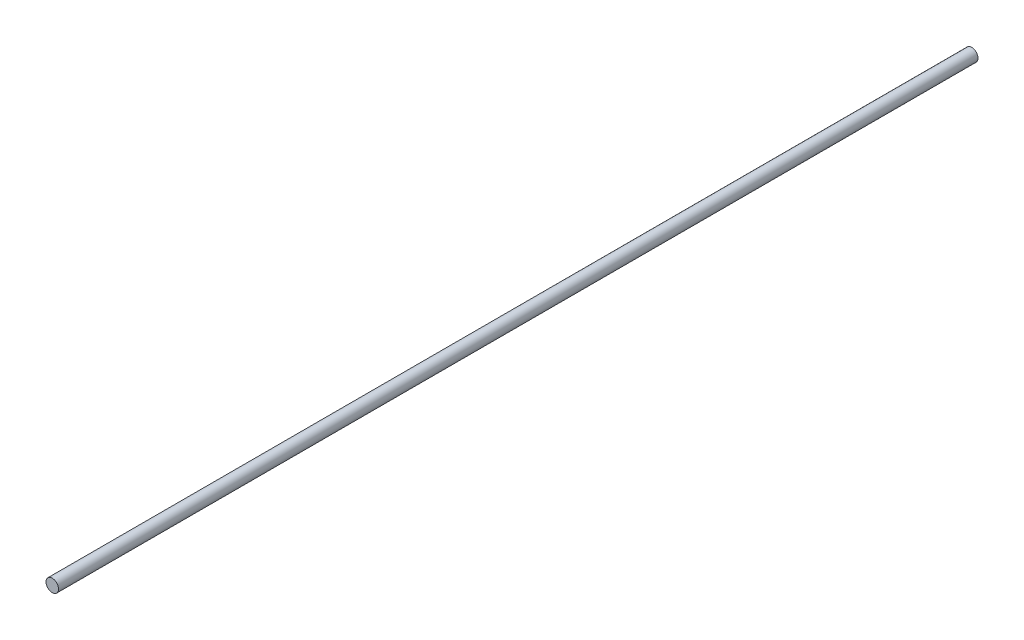
ISO-10303-21;
HEADER;
FILE_DESCRIPTION(('STEP AP214'),'2;1');
FILE_NAME('part.step','',(''),(''),'','','');
FILE_SCHEMA(('AUTOMOTIVE_DESIGN { 1 0 10303 214 1 1 1 1 }'));
ENDSEC;
DATA;
#1=APPLICATION_CONTEXT('core data for automotive mechanical design processes');
#2=APPLICATION_PROTOCOL_DEFINITION('international standard','automotive_design',2000,#1);
#3=PRODUCT_CONTEXT('',#1,'mechanical');
#4=PRODUCT('Part','Part','',(#3));
#5=PRODUCT_RELATED_PRODUCT_CATEGORY('part','',(#4));
#6=PRODUCT_DEFINITION_FORMATION('','',#4);
#7=PRODUCT_DEFINITION_CONTEXT('part definition',#1,'design');
#8=PRODUCT_DEFINITION('design','',#6,#7);
#9=PRODUCT_DEFINITION_SHAPE('','',#8);
#10=(LENGTH_UNIT() NAMED_UNIT(*) SI_UNIT(.MILLI.,.METRE.));
#11=(NAMED_UNIT(*) PLANE_ANGLE_UNIT() SI_UNIT($,.RADIAN.));
#12=(NAMED_UNIT(*) SI_UNIT($,.STERADIAN.) SOLID_ANGLE_UNIT());
#13=UNCERTAINTY_MEASURE_WITH_UNIT(LENGTH_MEASURE(1.E-05),#10,'distance_accuracy_value','');
#14=(GEOMETRIC_REPRESENTATION_CONTEXT(3) GLOBAL_UNCERTAINTY_ASSIGNED_CONTEXT((#13)) GLOBAL_UNIT_ASSIGNED_CONTEXT((#10,
#11,#12)) REPRESENTATION_CONTEXT('',''));
#15=CARTESIAN_POINT('',(0.,0.,0.));
#16=DIRECTION('',(0.,0.,1.));
#17=DIRECTION('',(1.,0.,0.));
#18=AXIS2_PLACEMENT_3D('',#15,#16,#17);
#19=CARTESIAN_POINT('',(0.,0.,-110.));
#20=DIRECTION('',(0.,0.,1.));
#21=DIRECTION('',(1.,0.,0.));
#22=AXIS2_PLACEMENT_3D('',#19,#20,#21);
#23=CYLINDRICAL_SURFACE('',#22,1.5);
#24=CARTESIAN_POINT('',(0.,0.,-110.));
#25=DIRECTION('',(0.,0.,1.));
#26=DIRECTION('',(1.,0.,0.));
#27=AXIS2_PLACEMENT_3D('',#24,#25,#26);
#28=CIRCLE('',#27,1.5);
#29=CARTESIAN_POINT('',(1.5,0.,-110.));
#30=VERTEX_POINT('',#29);
#31=EDGE_CURVE('E10',#30,#30,#28,.T.);
#32=ORIENTED_EDGE('',*,*,#31,.T.);
#33=EDGE_LOOP('',(#32));
#34=FACE_BOUND('',#33,.T.);
#35=CARTESIAN_POINT('',(0.,0.,110.));
#36=DIRECTION('',(0.,0.,1.));
#37=DIRECTION('',(1.,0.,0.));
#38=AXIS2_PLACEMENT_3D('',#35,#36,#37);
#39=CIRCLE('',#38,1.5);
#40=CARTESIAN_POINT('',(1.5,0.,110.));
#41=VERTEX_POINT('',#40);
#42=EDGE_CURVE('E35',#41,#41,#39,.T.);
#43=ORIENTED_EDGE('',*,*,#42,.F.);
#44=EDGE_LOOP('',(#43));
#45=FACE_BOUND('',#44,.T.);
#46=ADVANCED_FACE('F29',(#34,#45),#23,.T.);
#47=CARTESIAN_POINT('',(0.,0.,-110.));
#48=DIRECTION('',(0.,0.,1.));
#49=DIRECTION('',(1.,0.,0.));
#50=AXIS2_PLACEMENT_3D('',#47,#48,#49);
#51=PLANE('',#50);
#52=ORIENTED_EDGE('',*,*,#31,.F.);
#53=EDGE_LOOP('',(#52));
#54=FACE_BOUND('',#53,.T.);
#55=ADVANCED_FACE('F44',(#54),#51,.F.);
#56=CARTESIAN_POINT('',(0.,0.,110.));
#57=DIRECTION('',(0.,0.,1.));
#58=DIRECTION('',(1.,0.,0.));
#59=AXIS2_PLACEMENT_3D('',#56,#57,#58);
#60=PLANE('',#59);
#61=ORIENTED_EDGE('',*,*,#42,.T.);
#62=EDGE_LOOP('',(#61));
#63=FACE_BOUND('',#62,.T.);
#64=ADVANCED_FACE('F41',(#63),#60,.T.);
#65=CLOSED_SHELL('',(#46,#55,#64));
#66=MANIFOLD_SOLID_BREP('B2',#65);
#67=ADVANCED_BREP_SHAPE_REPRESENTATION('',(#18,#66),#14);
#68=SHAPE_DEFINITION_REPRESENTATION(#9,#67);
ENDSEC;
END-ISO-10303-21;
